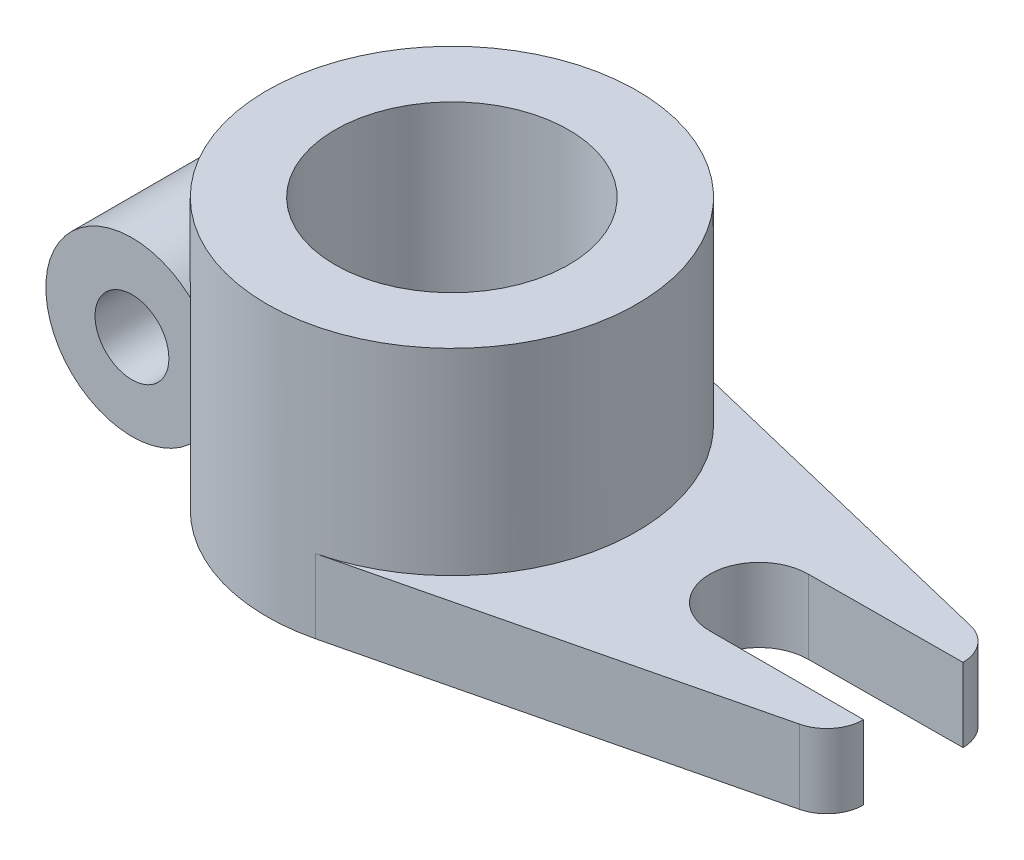
ISO-10303-21;
HEADER;
FILE_DESCRIPTION(('STEP AP214'),'2;1');
FILE_NAME('part.step','',(''),(''),'','','');
FILE_SCHEMA(('AUTOMOTIVE_DESIGN { 1 0 10303 214 1 1 1 1 }'));
ENDSEC;
DATA;
#1=APPLICATION_CONTEXT('core data for automotive mechanical design processes');
#2=APPLICATION_PROTOCOL_DEFINITION('international standard','automotive_design',2000,#1);
#3=PRODUCT_CONTEXT('',#1,'mechanical');
#4=PRODUCT('Part','Part','',(#3));
#5=PRODUCT_RELATED_PRODUCT_CATEGORY('part','',(#4));
#6=PRODUCT_DEFINITION_FORMATION('','',#4);
#7=PRODUCT_DEFINITION_CONTEXT('part definition',#1,'design');
#8=PRODUCT_DEFINITION('design','',#6,#7);
#9=PRODUCT_DEFINITION_SHAPE('','',#8);
#10=(LENGTH_UNIT() NAMED_UNIT(*) SI_UNIT(.MILLI.,.METRE.));
#11=(NAMED_UNIT(*) PLANE_ANGLE_UNIT() SI_UNIT($,.RADIAN.));
#12=(NAMED_UNIT(*) SI_UNIT($,.STERADIAN.) SOLID_ANGLE_UNIT());
#13=UNCERTAINTY_MEASURE_WITH_UNIT(LENGTH_MEASURE(1.E-05),#10,'distance_accuracy_value','');
#14=(GEOMETRIC_REPRESENTATION_CONTEXT(3) GLOBAL_UNCERTAINTY_ASSIGNED_CONTEXT((#13)) GLOBAL_UNIT_ASSIGNED_CONTEXT((#10,
#11,#12)) REPRESENTATION_CONTEXT('',''));
#15=CARTESIAN_POINT('',(0.,0.,0.));
#16=DIRECTION('',(0.,0.,1.));
#17=DIRECTION('',(1.,0.,0.));
#18=AXIS2_PLACEMENT_3D('',#15,#16,#17);
#19=CARTESIAN_POINT('',(0.,44.,-0.0753257186210804));
#20=DIRECTION('',(0.,-1.,0.));
#21=DIRECTION('',(0.,0.,-1.));
#22=AXIS2_PLACEMENT_3D('',#19,#20,#21);
#23=CYLINDRICAL_SURFACE('',#22,30.0732137950188);
#24=DIRECTION('',(0.,-1.,0.));
#25=VECTOR('',#24,1.);
#26=CARTESIAN_POINT('',(7.07125760516046,12.,29.1547188219261));
#27=LINE('',#26,#25);
#28=CARTESIAN_POINT('',(7.07125760516046,12.,29.1547188219261));
#29=VERTEX_POINT('',#28);
#30=CARTESIAN_POINT('',(7.07125760516046,0.,29.1547188219261));
#31=VERTEX_POINT('',#30);
#32=EDGE_CURVE('E316',#29,#31,#27,.T.);
#33=ORIENTED_EDGE('',*,*,#32,.F.);
#34=CARTESIAN_POINT('',(0.,12.,-0.0753257186210804));
#35=DIRECTION('',(0.,1.,0.));
#36=DIRECTION('',(0.,0.,1.));
#37=AXIS2_PLACEMENT_3D('',#34,#35,#36);
#38=CIRCLE('',#37,30.0732137950188);
#39=CARTESIAN_POINT('',(7.0867354895421,12.,-29.3016215506655));
#40=VERTEX_POINT('',#39);
#41=EDGE_CURVE('E257',#29,#40,#38,.T.);
#42=ORIENTED_EDGE('',*,*,#41,.T.);
#43=DIRECTION('',(0.,-1.,0.));
#44=VECTOR('',#43,1.);
#45=CARTESIAN_POINT('',(7.0867354895421,12.,-29.3016215506655));
#46=LINE('',#45,#44);
#47=CARTESIAN_POINT('',(7.0867354895421,0.,-29.3016215506655));
#48=VERTEX_POINT('',#47);
#49=EDGE_CURVE('E317',#40,#48,#46,.T.);
#50=ORIENTED_EDGE('',*,*,#49,.T.);
#51=CARTESIAN_POINT('',(0.,0.,-0.0753257186210804));
#52=DIRECTION('',(0.,1.,0.));
#53=DIRECTION('',(0.,0.,1.));
#54=AXIS2_PLACEMENT_3D('',#51,#52,#53);
#55=CIRCLE('',#54,30.0732137950188);
#56=EDGE_CURVE('E333',#48,#31,#55,.T.);
#57=ORIENTED_EDGE('',*,*,#56,.T.);
#58=EDGE_LOOP('',(#33,#42,#50,#57));
#59=FACE_BOUND('',#58,.T.);
#60=CARTESIAN_POINT('',(0.,44.,-0.0753257186210804));
#61=DIRECTION('',(0.,1.,0.));
#62=DIRECTION('',(0.,0.,1.));
#63=AXIS2_PLACEMENT_3D('',#60,#61,#62);
#64=CIRCLE('',#63,30.0732137950188);
#65=CARTESIAN_POINT('',(0.,44.,29.9978880763978));
#66=VERTEX_POINT('',#65);
#67=EDGE_CURVE('E131',#66,#66,#64,.T.);
#68=ORIENTED_EDGE('',*,*,#67,.F.);
#69=EDGE_LOOP('',(#68));
#70=FACE_BOUND('',#69,.T.);
#71=DIRECTION('',(0.,-1.,0.));
#72=VECTOR('',#71,1.);
#73=CARTESIAN_POINT('',(-25.5108395979611,44.,-16.));
#74=LINE('',#73,#72);
#75=CARTESIAN_POINT('',(-25.5108395979611,23.7415936061934,-16.));
#76=VERTEX_POINT('',#75);
#77=CARTESIAN_POINT('',(-25.5108395979611,5.03244543961911,-16.));
#78=VERTEX_POINT('',#77);
#79=EDGE_CURVE('E58',#76,#78,#74,.T.);
#80=ORIENTED_EDGE('',*,*,#79,.F.);
#81=CARTESIAN_POINT('',(-25.5108395979611,23.7415936061934,-16.));
#82=CARTESIAN_POINT('',(-25.6486968404899,23.8950698751368,-15.7792001161683));
#83=CARTESIAN_POINT('',(-25.7859366966199,24.041079451848,-15.5529224282568));
#84=CARTESIAN_POINT('',(-26.0578825566024,24.318918302519,-15.0905340203085));
#85=CARTESIAN_POINT('',(-26.1925897554957,24.4507544102522,-14.8544281158387));
#86=CARTESIAN_POINT('',(-26.4579334050152,24.7007942937792,-14.373966749596));
#87=CARTESIAN_POINT('',(-26.588580240997,24.8190353751764,-14.1296363629204));
#88=CARTESIAN_POINT('',(-26.8452189388277,25.0431983337729,-13.6330026353381));
#89=CARTESIAN_POINT('',(-26.9712102154159,25.1491186656742,-13.3806982993554));
#90=CARTESIAN_POINT('',(-27.3385021082901,25.4477854208744,-12.6180653288698));
#91=CARTESIAN_POINT('',(-27.5717722900233,25.6238665653162,-12.0972426778646));
#92=CARTESIAN_POINT('',(-28.0117514003724,25.938009471794,-11.0330659968112));
#93=CARTESIAN_POINT('',(-28.2184380661607,26.0760394764189,-10.4896935792604));
#94=CARTESIAN_POINT('',(-28.5225693178337,26.2695790962644,-9.61362159188703));
#95=CARTESIAN_POINT('',(-28.6298801691151,26.3356278488058,-9.28658258591072));
#96=CARTESIAN_POINT('',(-28.8336822640833,26.4577286908705,-8.62728208333612));
#97=CARTESIAN_POINT('',(-28.9301731040958,26.5137804074693,-8.29502039241625));
#98=CARTESIAN_POINT('',(-29.1119211159763,26.6168403016244,-7.62611139239538));
#99=CARTESIAN_POINT('',(-29.1971797117631,26.6638496258389,-7.28946464514815));
#100=CARTESIAN_POINT('',(-29.3561887034216,26.7496815758116,-6.61239761442363));
#101=CARTESIAN_POINT('',(-29.4299379151896,26.7885033593668,-6.27197694653313));
#102=CARTESIAN_POINT('',(-29.5659178761798,26.858796900382,-5.58686618518494));
#103=CARTESIAN_POINT('',(-29.6281081785771,26.890242945644,-5.24216544122918));
#104=CARTESIAN_POINT('',(-29.7404830761895,26.9462230687266,-4.55022464988491));
#105=CARTESIAN_POINT('',(-29.7906665425926,26.9707564967022,-4.20298436690409));
#106=CARTESIAN_POINT('',(-29.8788843182193,27.0133920072309,-3.50659899977771));
#107=CARTESIAN_POINT('',(-29.9169195076087,27.0314945557241,-3.15745405549357));
#108=CARTESIAN_POINT('',(-29.980751767984,27.0616366551952,-2.45778589367782));
#109=CARTESIAN_POINT('',(-30.0065487521332,27.0736761631527,-2.10726266638436));
#110=CARTESIAN_POINT('',(-30.0461930264099,27.092101629736,-1.39912950039715));
#111=CARTESIAN_POINT('',(-30.0598194535345,27.0983831477076,-1.04150447170693));
#112=CARTESIAN_POINT('',(-30.0742979447906,27.105055698933,-0.325977508053935));
#113=CARTESIAN_POINT('',(-30.0751512849287,27.105447320576,0.0319243956772461));
#114=CARTESIAN_POINT('',(-30.0640840125683,27.100349549857,0.74754764230904));
#115=CARTESIAN_POINT('',(-30.0521613128963,27.094859196579,1.10526894615283));
#116=CARTESIAN_POINT('',(-30.015568532973,27.0778789311632,1.81988569116742));
#117=CARTESIAN_POINT('',(-29.9908995673469,27.0663895436232,2.17678120181081));
#118=CARTESIAN_POINT('',(-29.9288798362313,27.037169522918,2.88915514172033));
#119=CARTESIAN_POINT('',(-29.8915311504381,27.019439913241,3.24463379370862));
#120=CARTESIAN_POINT('',(-29.8042505954569,26.9773691265466,3.95361901326047));
#121=CARTESIAN_POINT('',(-29.754319836107,26.9530285326556,4.3071257519527));
#122=CARTESIAN_POINT('',(-29.6420141683314,26.8972385250819,5.01155534722831));
#123=CARTESIAN_POINT('',(-29.5796408064258,26.8657899947967,5.3624785193142));
#124=CARTESIAN_POINT('',(-29.4426403545035,26.7951525322559,6.06111206618007));
#125=CARTESIAN_POINT('',(-29.3680137266677,26.7559638919379,6.40882256161667));
#126=CARTESIAN_POINT('',(-29.1549256819841,26.6411908258592,7.3225342012019));
#127=CARTESIAN_POINT('',(-29.0062483039321,26.5583957453009,7.88531024662896));
#128=CARTESIAN_POINT('',(-28.6779521890979,26.3657757948193,8.99711687883838));
#129=CARTESIAN_POINT('',(-28.4983315524542,26.2559492650351,9.5461466192498));
#130=CARTESIAN_POINT('',(-28.1112175083914,26.0046764367056,10.6244152983607));
#131=CARTESIAN_POINT('',(-27.903835782197,25.8633553979485,11.1537232003987));
#132=CARTESIAN_POINT('',(-27.4640806469496,25.5430310058608,12.1900200697223));
#133=CARTESIAN_POINT('',(-27.2317204647276,25.3640475482855,12.6970206508895));
#134=CARTESIAN_POINT('',(-26.8663525761685,25.0610064931571,13.4404204516207));
#135=CARTESIAN_POINT('',(-26.7407246255966,24.9532650143844,13.6872022206004));
#136=CARTESIAN_POINT('',(-26.4851894901964,24.7255664597394,14.1727660854565));
#137=CARTESIAN_POINT('',(-26.3552830047745,24.6056113737697,14.4115494760711));
#138=CARTESIAN_POINT('',(-26.0916855194308,24.3521767332322,14.8811046898308));
#139=CARTESIAN_POINT('',(-25.9579823426928,24.2186489926527,15.1118437654481));
#140=CARTESIAN_POINT('',(-25.6883903842427,23.9375746789897,15.5635479509335));
#141=CARTESIAN_POINT('',(-25.5525001819241,23.7900186609485,15.7845063268416));
#142=CARTESIAN_POINT('',(-25.4161777417682,23.6351063376499,16.));
#143=B_SPLINE_CURVE_WITH_KNOTS('',3,(#81,#82,#83,#84,#85,#86,#87,#88,#89,#90,#91,#92,#93,#94,
#95,#96,#97,#98,#99,#100,#101,#102,#103,#104,#105,#106,#107,#108,#109,#110,#111,#112,#113,#114,
#115,#116,#117,#118,#119,#120,#121,#122,#123,#124,#125,#126,#127,#128,#129,#130,#131,#132,#133,
#134,#135,#136,#137,#138,#139,#140,#141,#142),.UNSPECIFIED.,.F.,.F.,(4,2,2,2,2,2,2,2,2,2,2,2,2,
2,2,2,2,2,2,2,2,2,2,2,2,2,2,2,2,2,4),(0.,0.906290741578307,1.81214253435976,2.71544609095774,
3.61886282018124,5.40784453156932,7.19831483438022,8.24942647076252,9.30057730909456,
10.351594763861,11.402720277785,12.4574573450982,13.5122935336345,14.5670532799197,
15.6218205101773,16.6953613621131,17.7687949686845,18.8424039647905,19.9159190926858,
20.98925823028,22.0625027240091,23.1356139046894,24.2086846179927,25.9709203459212,
27.7332643106043,29.4887203616716,31.2432513836155,32.1343477453389,33.025299156749,
33.9195321200563,34.8143714747566),.UNSPECIFIED.);
#144=CARTESIAN_POINT('',(-25.4161777417682,23.6351063376499,16.));
#145=VERTEX_POINT('',#144);
#146=EDGE_CURVE('E137',#76,#145,#143,.T.);
#147=ORIENTED_EDGE('',*,*,#146,.T.);
#148=DIRECTION('',(0.,-1.,0.));
#149=VECTOR('',#148,1.);
#150=CARTESIAN_POINT('',(-25.4161777417682,44.,16.));
#151=LINE('',#150,#149);
#152=CARTESIAN_POINT('',(-25.4161777417682,5.1389327081626,16.));
#153=VERTEX_POINT('',#152);
#154=EDGE_CURVE('E126',#145,#153,#151,.T.);
#155=ORIENTED_EDGE('',*,*,#154,.T.);
#156=CARTESIAN_POINT('',(-25.4161777417682,5.1389327081626,16.));
#157=CARTESIAN_POINT('',(-25.554400424566,4.98186197877941,15.7815042594419));
#158=CARTESIAN_POINT('',(-25.6921768526131,4.83235477355709,15.5573911648759));
#159=CARTESIAN_POINT('',(-25.9654871899697,4.54773456758512,15.0990750479396));
#160=CARTESIAN_POINT('',(-26.1010221899405,4.41261438107739,14.8648771454118));
#161=CARTESIAN_POINT('',(-26.3682500941847,4.15625431152586,14.3880123255589));
#162=CARTESIAN_POINT('',(-26.4999530650097,4.03497503610374,14.1453721451277));
#163=CARTESIAN_POINT('',(-26.7589075749908,3.80496039401729,13.651901478171));
#164=CARTESIAN_POINT('',(-26.8861585361926,3.69622665181923,13.4010699363651));
#165=CARTESIAN_POINT('',(-27.2573317027092,3.38960702117639,12.6427761082562));
#166=CARTESIAN_POINT('',(-27.4934765045141,3.20868969530649,12.124543300907));
#167=CARTESIAN_POINT('',(-27.9396520997629,2.88564420871484,11.0649210664658));
#168=CARTESIAN_POINT('',(-28.1496603792953,2.74354936534135,10.5235122077101));
#169=CARTESIAN_POINT('',(-28.4584854396064,2.54461041882338,9.65240981365329));
#170=CARTESIAN_POINT('',(-28.5671484469232,2.47692678659113,9.32858540283433));
#171=CARTESIAN_POINT('',(-28.7738820047976,2.35162988962594,8.67562417769502));
#172=CARTESIAN_POINT('',(-28.871952174605,2.29401698683059,8.34648717290655));
#173=CARTESIAN_POINT('',(-29.0570725224114,2.18790459275877,7.68374052206638));
#174=CARTESIAN_POINT('',(-29.1441242311798,2.1394038350986,7.35013150443862));
#175=CARTESIAN_POINT('',(-29.3069249135501,2.05064916033521,6.67904800670706));
#176=CARTESIAN_POINT('',(-29.3826727213689,2.01039609366546,6.34157313177256));
#177=CARTESIAN_POINT('',(-29.5228585213875,1.93728135805668,5.66224548768087));
#178=CARTESIAN_POINT('',(-29.5872559313252,1.9044460974721,5.32038151805762));
#179=CARTESIAN_POINT('',(-29.7042337810414,1.84572277806772,4.63401526494324));
#180=CARTESIAN_POINT('',(-29.7568131113179,1.81983537148029,4.28951273687656));
#181=CARTESIAN_POINT('',(-29.8500042027725,1.77450968051956,3.59849750115876));
#182=CARTESIAN_POINT('',(-29.8906167902891,1.75507095083466,3.25198493399239));
#183=CARTESIAN_POINT('',(-29.9597789099311,1.72225390371002,2.55747154479749));
#184=CARTESIAN_POINT('',(-29.9883283496378,1.70887563270085,2.20947071138763));
#185=CARTESIAN_POINT('',(-30.0337246675484,1.68770985432633,1.5058767692956));
#186=CARTESIAN_POINT('',(-30.0503383795012,1.68003364486584,1.15026526137469));
#187=CARTESIAN_POINT('',(-30.0709283521431,1.67053192719295,0.438634515679646));
#188=CARTESIAN_POINT('',(-30.074905858699,1.66870584218733,0.0826153215639992));
#189=CARTESIAN_POINT('',(-30.0702173668191,1.67086411681511,-0.629377897021013));
#190=CARTESIAN_POINT('',(-30.0615493991652,1.67484938142165,-0.985351905820157));
#191=CARTESIAN_POINT('',(-30.0315879213282,1.68871610512008,-1.69662306366801));
#192=CARTESIAN_POINT('',(-30.0102954975466,1.6985970568573,-2.05192026832023));
#193=CARTESIAN_POINT('',(-29.9551401265152,1.72446165762479,-2.76127149183814));
#194=CARTESIAN_POINT('',(-29.9212787623255,1.74044453812344,-3.11532566159775));
#195=CARTESIAN_POINT('',(-29.8410733998017,1.77884459962999,-3.82163669497937));
#196=CARTESIAN_POINT('',(-29.7947304754421,1.80126122705763,-4.1738937105814));
#197=CARTESIAN_POINT('',(-29.6896867181853,1.85298484125099,-4.87601966152845));
#198=CARTESIAN_POINT('',(-29.6309872438319,1.88229107057911,-5.2258888550409));
#199=CARTESIAN_POINT('',(-29.5014045932143,1.94838082416197,-5.92262544144991));
#200=CARTESIAN_POINT('',(-29.4305218225473,1.98516409950392,-6.26949293387321));
#201=CARTESIAN_POINT('',(-29.2249014516418,2.09449377931722,-7.19246075699274));
#202=CARTESIAN_POINT('',(-29.0793454563459,2.17442630394081,-7.76534448772458));
#203=CARTESIAN_POINT('',(-28.7561032222849,2.36137421122821,-8.8975335707999));
#204=CARTESIAN_POINT('',(-28.5784146487901,2.46839156208164,-9.45683793312471));
#205=CARTESIAN_POINT('',(-28.1938961829865,2.71421789866929,-10.5557741599948));
#206=CARTESIAN_POINT('',(-27.9871813910684,2.85290260901372,-11.0954736105704));
#207=CARTESIAN_POINT('',(-27.5475805715135,3.16819320682722,-12.1524280032906));
#208=CARTESIAN_POINT('',(-27.3147087674712,3.34477853192407,-12.6696949336437));
#209=CARTESIAN_POINT('',(-26.8279298156059,3.74233303641053,-13.6757544891623));
#210=CARTESIAN_POINT('',(-26.5740579379998,3.96322865037145,-14.1645926001577));
#211=CARTESIAN_POINT('',(-26.1822606755596,4.33333467754066,-14.8726496147746));
#212=CARTESIAN_POINT('',(-26.0495743829789,4.46344051995646,-15.1048745992723));
#213=CARTESIAN_POINT('',(-25.7817422597384,4.7374211154805,-15.559828800354));
#214=CARTESIAN_POINT('',(-25.6465948640804,4.88130489642735,-15.7825516507139));
#215=CARTESIAN_POINT('',(-25.5108395979611,5.03244543961911,-16.));
#216=B_SPLINE_CURVE_WITH_KNOTS('',3,(#156,#157,#158,#159,#160,#161,#162,#163,#164,#165,#166,
#167,#168,#169,#170,#171,#172,#173,#174,#175,#176,#177,#178,#179,#180,#181,#182,#183,#184,#185,
#186,#187,#188,#189,#190,#191,#192,#193,#194,#195,#196,#197,#198,#199,#200,#201,#202,#203,#204,
#205,#206,#207,#208,#209,#210,#211,#212,#213,#214,#215),.UNSPECIFIED.,.F.,.F.,(4,2,2,2,2,2,2,2,
2,2,2,2,2,2,2,2,2,2,2,2,2,2,2,2,2,2,2,2,2,4),(0.,0.907299527272065,1.81414374662887,
2.71833901237477,3.62265122732876,5.41253085088335,7.20394175342913,8.24826432858637,
9.29262442852438,10.3368392783048,11.381161744736,12.4291455134475,13.4772276276427,
14.5252373517449,15.5732551047553,16.6412270905068,17.709093776285,18.7771267734957,
19.8450678741413,20.9128745130587,21.9805893019939,23.0481867620239,24.1157486872776,
25.9035005156103,27.6913822929168,29.4723647560681,31.2523834071437,33.0294709132497,
33.9213196318637,34.813756775937),.UNSPECIFIED.);
#217=EDGE_CURVE('E135',#153,#78,#216,.T.);
#218=ORIENTED_EDGE('',*,*,#217,.T.);
#219=EDGE_LOOP('',(#80,#147,#155,#218));
#220=FACE_BOUND('',#219,.T.);
#221=ADVANCED_FACE('F50',(#59,#70,#220),#23,.T.);
#222=CARTESIAN_POINT('',(0.,44.,-0.0753257186210804));
#223=DIRECTION('',(0.,-1.,0.));
#224=DIRECTION('',(0.,0.,-1.));
#225=AXIS2_PLACEMENT_3D('',#222,#223,#224);
#226=CYLINDRICAL_SURFACE('',#225,19.);
#227=CARTESIAN_POINT('',(0.,44.,-0.0753257186210804));
#228=DIRECTION('',(0.,1.,0.));
#229=DIRECTION('',(0.,0.,1.));
#230=AXIS2_PLACEMENT_3D('',#227,#228,#229);
#231=CIRCLE('',#230,19.);
#232=CARTESIAN_POINT('',(0.,44.,18.9246742813789));
#233=VERTEX_POINT('',#232);
#234=EDGE_CURVE('E332',#233,#233,#231,.T.);
#235=ORIENTED_EDGE('',*,*,#234,.T.);
#236=EDGE_LOOP('',(#235));
#237=FACE_BOUND('',#236,.T.);
#238=CARTESIAN_POINT('',(0.,0.,-0.0753257186210804));
#239=DIRECTION('',(0.,1.,0.));
#240=DIRECTION('',(0.,0.,1.));
#241=AXIS2_PLACEMENT_3D('',#238,#239,#240);
#242=CIRCLE('',#241,19.);
#243=CARTESIAN_POINT('',(0.,0.,18.9246742813789));
#244=VERTEX_POINT('',#243);
#245=EDGE_CURVE('E329',#244,#244,#242,.T.);
#246=ORIENTED_EDGE('',*,*,#245,.F.);
#247=EDGE_LOOP('',(#246));
#248=FACE_BOUND('',#247,.T.);
#249=ADVANCED_FACE('F47',(#237,#248),#226,.F.);
#250=CARTESIAN_POINT('',(0.,44.,0.));
#251=DIRECTION('',(0.,1.,0.));
#252=DIRECTION('',(0.,0.,1.));
#253=AXIS2_PLACEMENT_3D('',#250,#251,#252);
#254=PLANE('',#253);
#255=ORIENTED_EDGE('',*,*,#234,.F.);
#256=EDGE_LOOP('',(#255));
#257=FACE_BOUND('',#256,.T.);
#258=ORIENTED_EDGE('',*,*,#67,.T.);
#259=EDGE_LOOP('',(#258));
#260=FACE_BOUND('',#259,.T.);
#261=ADVANCED_FACE('F205',(#257,#260),#254,.T.);
#262=CARTESIAN_POINT('',(0.,0.,0.));
#263=DIRECTION('',(0.,1.,0.));
#264=DIRECTION('',(0.,0.,1.));
#265=AXIS2_PLACEMENT_3D('',#262,#263,#264);
#266=PLANE('',#265);
#267=ORIENTED_EDGE('',*,*,#245,.T.);
#268=EDGE_LOOP('',(#267));
#269=FACE_BOUND('',#268,.T.);
#270=ORIENTED_EDGE('',*,*,#56,.F.);
#271=DIRECTION('',(0.971838129148847,0.,0.23564942336545));
#272=VECTOR('',#271,1.);
#273=CARTESIAN_POINT('',(7.10398606547691,0.,-29.2974386644936));
#274=LINE('',#273,#272);
#275=CARTESIAN_POINT('',(70.4133948669904,0.,-13.9462960922728));
#276=VERTEX_POINT('',#275);
#277=EDGE_CURVE('E288',#48,#276,#274,.T.);
#278=ORIENTED_EDGE('',*,*,#277,.T.);
#279=CARTESIAN_POINT('',(68.9993100710451,0.,-8.11449093475282));
#280=DIRECTION('',(0.,1.,0.));
#281=DIRECTION('',(0.,0.,1.));
#282=AXIS2_PLACEMENT_3D('',#279,#280,#281);
#283=CIRCLE('',#282,6.0007988805992);
#284=CARTESIAN_POINT('',(75.,0.,-8.15065143724216));
#285=VERTEX_POINT('',#284);
#286=EDGE_CURVE('E284',#285,#276,#283,.T.);
#287=ORIENTED_EDGE('',*,*,#286,.F.);
#288=DIRECTION('',(0.999981843810049,0.,-0.00602594807938787));
#289=VECTOR('',#288,1.);
#290=CARTESIAN_POINT('',(-0.0463911068562734,0.,-7.69841757004281));
#291=LINE('',#290,#289);
#292=CARTESIAN_POINT('',(50.,0.,-8.00000000000135));
#293=VERTEX_POINT('',#292);
#294=EDGE_CURVE('E248',#293,#285,#291,.T.);
#295=ORIENTED_EDGE('',*,*,#294,.F.);
#296=CARTESIAN_POINT('',(50.,0.,0.));
#297=DIRECTION('',(0.,1.,0.));
#298=DIRECTION('',(0.,0.,1.));
#299=AXIS2_PLACEMENT_3D('',#296,#297,#298);
#300=CIRCLE('',#299,8.00000000000114);
#301=CARTESIAN_POINT('',(49.9999999999999,0.,8.00000000000092));
#302=VERTEX_POINT('',#301);
#303=EDGE_CURVE('E254',#293,#302,#300,.T.);
#304=ORIENTED_EDGE('',*,*,#303,.T.);
#305=DIRECTION('',(1.,0.,0.));
#306=VECTOR('',#305,1.);
#307=CARTESIAN_POINT('',(2.95874436062706E-13,0.,8.00000000000277));
#308=LINE('',#307,#306);
#309=CARTESIAN_POINT('',(75.,0.,8.));
#310=VERTEX_POINT('',#309);
#311=EDGE_CURVE('E299',#302,#310,#308,.T.);
#312=ORIENTED_EDGE('',*,*,#311,.T.);
#313=CARTESIAN_POINT('',(69.,0.,8.00000000000021));
#314=DIRECTION('',(0.,1.,0.));
#315=DIRECTION('',(0.,0.,1.));
#316=AXIS2_PLACEMENT_3D('',#313,#314,#315);
#317=CIRCLE('',#316,6.00000000000001);
#318=CARTESIAN_POINT('',(70.4108084995555,0.,13.8317766913338));
#319=VERTEX_POINT('',#318);
#320=EDGE_CURVE('E291',#319,#310,#317,.T.);
#321=ORIENTED_EDGE('',*,*,#320,.F.);
#322=DIRECTION('',(0.971962781888934,0.,-0.235134749925919));
#323=VECTOR('',#322,1.);
#324=CARTESIAN_POINT('',(7.0540424977776,0.,29.1588834566681));
#325=LINE('',#324,#323);
#326=EDGE_CURVE('E287',#31,#319,#325,.T.);
#327=ORIENTED_EDGE('',*,*,#326,.F.);
#328=EDGE_LOOP('',(#270,#278,#287,#295,#304,#312,#321,#327));
#329=FACE_BOUND('',#328,.T.);
#330=ADVANCED_FACE('F199',(#269,#329),#266,.F.);
#331=CARTESIAN_POINT('',(-0.0463911068562734,12.,-7.69841757004281));
#332=DIRECTION('',(-0.00602594807938787,0.,-0.999981843810049));
#333=DIRECTION('',(-0.999981843810049,0.,0.00602594807938787));
#334=AXIS2_PLACEMENT_3D('',#331,#332,#333);
#335=PLANE('',#334);
#336=ORIENTED_EDGE('',*,*,#294,.T.);
#337=DIRECTION('',(0.,-1.,0.));
#338=VECTOR('',#337,1.);
#339=CARTESIAN_POINT('',(75.,12.,-8.15065143724216));
#340=LINE('',#339,#338);
#341=CARTESIAN_POINT('',(75.,12.,-8.15065143724216));
#342=VERTEX_POINT('',#341);
#343=EDGE_CURVE('E326',#342,#285,#340,.T.);
#344=ORIENTED_EDGE('',*,*,#343,.F.);
#345=DIRECTION('',(0.999981843810049,0.,-0.00602594807938787));
#346=VECTOR('',#345,1.);
#347=CARTESIAN_POINT('',(-0.0463911068562734,12.,-7.69841757004281));
#348=LINE('',#347,#346);
#349=CARTESIAN_POINT('',(50.,12.,-8.00000000000135));
#350=VERTEX_POINT('',#349);
#351=EDGE_CURVE('E247',#350,#342,#348,.T.);
#352=ORIENTED_EDGE('',*,*,#351,.F.);
#353=DIRECTION('',(0.,-1.,0.));
#354=VECTOR('',#353,1.);
#355=CARTESIAN_POINT('',(50.,12.,-8.00000000000135));
#356=LINE('',#355,#354);
#357=EDGE_CURVE('E279',#350,#293,#356,.T.);
#358=ORIENTED_EDGE('',*,*,#357,.T.);
#359=EDGE_LOOP('',(#336,#344,#352,#358));
#360=FACE_BOUND('',#359,.T.);
#361=ADVANCED_FACE('F198',(#360),#335,.F.);
#362=CARTESIAN_POINT('',(68.9993100710451,12.,-8.11449093475282));
#363=DIRECTION('',(0.,-1.,0.));
#364=DIRECTION('',(0.,0.,-1.));
#365=AXIS2_PLACEMENT_3D('',#362,#363,#364);
#366=CYLINDRICAL_SURFACE('',#365,6.0007988805992);
#367=ORIENTED_EDGE('',*,*,#286,.T.);
#368=DIRECTION('',(0.,-1.,0.));
#369=VECTOR('',#368,1.);
#370=CARTESIAN_POINT('',(70.4133948669904,12.,-13.9462960922728));
#371=LINE('',#370,#369);
#372=CARTESIAN_POINT('',(70.4133948669904,12.,-13.9462960922728));
#373=VERTEX_POINT('',#372);
#374=EDGE_CURVE('E323',#373,#276,#371,.T.);
#375=ORIENTED_EDGE('',*,*,#374,.F.);
#376=CARTESIAN_POINT('',(68.9993100710451,12.,-8.11449093475282));
#377=DIRECTION('',(0.,1.,0.));
#378=DIRECTION('',(0.,0.,1.));
#379=AXIS2_PLACEMENT_3D('',#376,#377,#378);
#380=CIRCLE('',#379,6.0007988805992);
#381=EDGE_CURVE('E255',#342,#373,#380,.T.);
#382=ORIENTED_EDGE('',*,*,#381,.F.);
#383=ORIENTED_EDGE('',*,*,#343,.T.);
#384=EDGE_LOOP('',(#367,#375,#382,#383));
#385=FACE_BOUND('',#384,.T.);
#386=ADVANCED_FACE('F195',(#385),#366,.T.);
#387=CARTESIAN_POINT('',(7.10398606547691,12.,-29.2974386644936));
#388=DIRECTION('',(0.23564942336545,0.,-0.971838129148847));
#389=DIRECTION('',(-0.971838129148847,0.,-0.23564942336545));
#390=AXIS2_PLACEMENT_3D('',#387,#388,#389);
#391=PLANE('',#390);
#392=ORIENTED_EDGE('',*,*,#277,.F.);
#393=ORIENTED_EDGE('',*,*,#49,.F.);
#394=DIRECTION('',(0.971838129148847,0.,0.23564942336545));
#395=VECTOR('',#394,1.);
#396=CARTESIAN_POINT('',(7.10398606547691,12.,-29.2974386644936));
#397=LINE('',#396,#395);
#398=EDGE_CURVE('E74',#40,#373,#397,.T.);
#399=ORIENTED_EDGE('',*,*,#398,.T.);
#400=ORIENTED_EDGE('',*,*,#374,.T.);
#401=EDGE_LOOP('',(#392,#393,#399,#400));
#402=FACE_BOUND('',#401,.T.);
#403=ADVANCED_FACE('F187',(#402),#391,.T.);
#404=CARTESIAN_POINT('',(7.0540424977776,12.,29.1588834566681));
#405=DIRECTION('',(-0.235134749925919,0.,-0.971962781888934));
#406=DIRECTION('',(-0.971962781888934,0.,0.235134749925919));
#407=AXIS2_PLACEMENT_3D('',#404,#405,#406);
#408=PLANE('',#407);
#409=ORIENTED_EDGE('',*,*,#326,.T.);
#410=DIRECTION('',(0.,-1.,0.));
#411=VECTOR('',#410,1.);
#412=CARTESIAN_POINT('',(70.4108084995555,12.,13.8317766913338));
#413=LINE('',#412,#411);
#414=CARTESIAN_POINT('',(70.4108084995555,12.,13.8317766913338));
#415=VERTEX_POINT('',#414);
#416=EDGE_CURVE('E315',#415,#319,#413,.T.);
#417=ORIENTED_EDGE('',*,*,#416,.F.);
#418=DIRECTION('',(0.971962781888934,0.,-0.235134749925919));
#419=VECTOR('',#418,1.);
#420=CARTESIAN_POINT('',(7.0540424977776,12.,29.1588834566681));
#421=LINE('',#420,#419);
#422=EDGE_CURVE('E262',#29,#415,#421,.T.);
#423=ORIENTED_EDGE('',*,*,#422,.F.);
#424=ORIENTED_EDGE('',*,*,#32,.T.);
#425=EDGE_LOOP('',(#409,#417,#423,#424));
#426=FACE_BOUND('',#425,.T.);
#427=ADVANCED_FACE('F184',(#426),#408,.F.);
#428=CARTESIAN_POINT('',(69.,12.,8.00000000000021));
#429=DIRECTION('',(0.,-1.,0.));
#430=DIRECTION('',(0.,0.,-1.));
#431=AXIS2_PLACEMENT_3D('',#428,#429,#430);
#432=CYLINDRICAL_SURFACE('',#431,6.00000000000001);
#433=ORIENTED_EDGE('',*,*,#320,.T.);
#434=DIRECTION('',(0.,-1.,0.));
#435=VECTOR('',#434,1.);
#436=CARTESIAN_POINT('',(75.,12.,8.));
#437=LINE('',#436,#435);
#438=CARTESIAN_POINT('',(75.,12.,8.));
#439=VERTEX_POINT('',#438);
#440=EDGE_CURVE('E310',#439,#310,#437,.T.);
#441=ORIENTED_EDGE('',*,*,#440,.F.);
#442=CARTESIAN_POINT('',(69.,12.,8.00000000000021));
#443=DIRECTION('',(0.,1.,0.));
#444=DIRECTION('',(0.,0.,1.));
#445=AXIS2_PLACEMENT_3D('',#442,#443,#444);
#446=CIRCLE('',#445,6.00000000000001);
#447=EDGE_CURVE('E270',#415,#439,#446,.T.);
#448=ORIENTED_EDGE('',*,*,#447,.F.);
#449=ORIENTED_EDGE('',*,*,#416,.T.);
#450=EDGE_LOOP('',(#433,#441,#448,#449));
#451=FACE_BOUND('',#450,.T.);
#452=ADVANCED_FACE('F177',(#451),#432,.T.);
#453=CARTESIAN_POINT('',(2.95874436062706E-13,12.,8.00000000000277));
#454=DIRECTION('',(0.,0.,-1.));
#455=DIRECTION('',(-1.,0.,0.));
#456=AXIS2_PLACEMENT_3D('',#453,#454,#455);
#457=PLANE('',#456);
#458=ORIENTED_EDGE('',*,*,#311,.F.);
#459=DIRECTION('',(0.,-1.,0.));
#460=VECTOR('',#459,1.);
#461=CARTESIAN_POINT('',(49.9999999999999,12.,8.00000000000092));
#462=LINE('',#461,#460);
#463=CARTESIAN_POINT('',(49.9999999999999,12.,8.00000000000092));
#464=VERTEX_POINT('',#463);
#465=EDGE_CURVE('E308',#464,#302,#462,.T.);
#466=ORIENTED_EDGE('',*,*,#465,.F.);
#467=DIRECTION('',(1.,0.,0.));
#468=VECTOR('',#467,1.);
#469=CARTESIAN_POINT('',(2.95874436062706E-13,12.,8.00000000000277));
#470=LINE('',#469,#468);
#471=EDGE_CURVE('E269',#464,#439,#470,.T.);
#472=ORIENTED_EDGE('',*,*,#471,.T.);
#473=ORIENTED_EDGE('',*,*,#440,.T.);
#474=EDGE_LOOP('',(#458,#466,#472,#473));
#475=FACE_BOUND('',#474,.T.);
#476=ADVANCED_FACE('F178',(#475),#457,.T.);
#477=CARTESIAN_POINT('',(50.,12.,0.));
#478=DIRECTION('',(0.,-1.,0.));
#479=DIRECTION('',(0.,0.,-1.));
#480=AXIS2_PLACEMENT_3D('',#477,#478,#479);
#481=CYLINDRICAL_SURFACE('',#480,8.00000000000114);
#482=ORIENTED_EDGE('',*,*,#303,.F.);
#483=ORIENTED_EDGE('',*,*,#357,.F.);
#484=CARTESIAN_POINT('',(50.,12.,0.));
#485=DIRECTION('',(0.,1.,0.));
#486=DIRECTION('',(0.,0.,1.));
#487=AXIS2_PLACEMENT_3D('',#484,#485,#486);
#488=CIRCLE('',#487,8.00000000000114);
#489=EDGE_CURVE('E273',#350,#464,#488,.T.);
#490=ORIENTED_EDGE('',*,*,#489,.T.);
#491=ORIENTED_EDGE('',*,*,#465,.T.);
#492=EDGE_LOOP('',(#482,#483,#490,#491));
#493=FACE_BOUND('',#492,.T.);
#494=ADVANCED_FACE('F172',(#493),#481,.F.);
#495=CARTESIAN_POINT('',(0.,12.,0.));
#496=DIRECTION('',(0.,1.,0.));
#497=DIRECTION('',(0.,0.,1.));
#498=AXIS2_PLACEMENT_3D('',#495,#496,#497);
#499=PLANE('',#498);
#500=ORIENTED_EDGE('',*,*,#351,.T.);
#501=ORIENTED_EDGE('',*,*,#381,.T.);
#502=ORIENTED_EDGE('',*,*,#398,.F.);
#503=ORIENTED_EDGE('',*,*,#41,.F.);
#504=ORIENTED_EDGE('',*,*,#422,.T.);
#505=ORIENTED_EDGE('',*,*,#447,.T.);
#506=ORIENTED_EDGE('',*,*,#471,.F.);
#507=ORIENTED_EDGE('',*,*,#489,.F.);
#508=EDGE_LOOP('',(#500,#501,#502,#503,#504,#505,#506,#507));
#509=FACE_BOUND('',#508,.T.);
#510=ADVANCED_FACE('F166',(#509),#499,.T.);
#511=CARTESIAN_POINT('',(-35.9267862049812,14.3870195229063,-16.));
#512=DIRECTION('',(0.,0.,1.));
#513=DIRECTION('',(1.,0.,0.));
#514=AXIS2_PLACEMENT_3D('',#511,#512,#513);
#515=CYLINDRICAL_SURFACE('',#514,14.);
#516=ORIENTED_EDGE('',*,*,#146,.F.);
#517=CARTESIAN_POINT('',(-35.9267862049812,14.3870195229063,-16.));
#518=DIRECTION('',(0.,0.,1.));
#519=DIRECTION('',(1.,0.,0.));
#520=AXIS2_PLACEMENT_3D('',#517,#518,#519);
#521=CIRCLE('',#520,14.);
#522=EDGE_CURVE('E242',#76,#78,#521,.T.);
#523=ORIENTED_EDGE('',*,*,#522,.T.);
#524=ORIENTED_EDGE('',*,*,#217,.F.);
#525=CARTESIAN_POINT('',(-35.9267862049812,14.3870195229063,16.));
#526=DIRECTION('',(0.,0.,1.));
#527=DIRECTION('',(1.,0.,0.));
#528=AXIS2_PLACEMENT_3D('',#525,#526,#527);
#529=CIRCLE('',#528,14.);
#530=EDGE_CURVE('E68',#145,#153,#529,.T.);
#531=ORIENTED_EDGE('',*,*,#530,.F.);
#532=EDGE_LOOP('',(#516,#523,#524,#531));
#533=FACE_BOUND('',#532,.T.);
#534=ADVANCED_FACE('F136',(#533),#515,.T.);
#535=CARTESIAN_POINT('',(-35.9267862049812,14.3870195229063,-16.));
#536=DIRECTION('',(0.,0.,1.));
#537=DIRECTION('',(1.,0.,0.));
#538=AXIS2_PLACEMENT_3D('',#535,#536,#537);
#539=PLANE('',#538);
#540=CARTESIAN_POINT('',(-35.9267862049812,14.3870195229063,-16.));
#541=DIRECTION('',(0.,0.,1.));
#542=DIRECTION('',(1.,0.,0.));
#543=AXIS2_PLACEMENT_3D('',#540,#541,#542);
#544=CIRCLE('',#543,6.00000000000001);
#545=CARTESIAN_POINT('',(-29.9267862049811,14.3870195229063,-16.));
#546=VERTEX_POINT('',#545);
#547=EDGE_CURVE('E141',#546,#546,#544,.T.);
#548=ORIENTED_EDGE('',*,*,#547,.T.);
#549=EDGE_LOOP('',(#548));
#550=FACE_BOUND('',#549,.T.);
#551=ORIENTED_EDGE('',*,*,#522,.F.);
#552=ORIENTED_EDGE('',*,*,#79,.T.);
#553=EDGE_LOOP('',(#551,#552));
#554=FACE_BOUND('',#553,.T.);
#555=ADVANCED_FACE('F169',(#550,#554),#539,.F.);
#556=CARTESIAN_POINT('',(-35.9267862049812,14.3870195229063,-16.));
#557=DIRECTION('',(0.,0.,1.));
#558=DIRECTION('',(1.,0.,0.));
#559=AXIS2_PLACEMENT_3D('',#556,#557,#558);
#560=CYLINDRICAL_SURFACE('',#559,6.00000000000001);
#561=CARTESIAN_POINT('',(-35.9267862049812,14.3870195229063,16.));
#562=DIRECTION('',(0.,0.,1.));
#563=DIRECTION('',(1.,0.,0.));
#564=AXIS2_PLACEMENT_3D('',#561,#562,#563);
#565=CIRCLE('',#564,6.00000000000001);
#566=CARTESIAN_POINT('',(-29.9267862049811,14.3870195229063,16.));
#567=VERTEX_POINT('',#566);
#568=EDGE_CURVE('E145',#567,#567,#565,.T.);
#569=ORIENTED_EDGE('',*,*,#568,.T.);
#570=EDGE_LOOP('',(#569));
#571=FACE_BOUND('',#570,.T.);
#572=ORIENTED_EDGE('',*,*,#547,.F.);
#573=EDGE_LOOP('',(#572));
#574=FACE_BOUND('',#573,.T.);
#575=CARTESIAN_POINT('',(-29.9267862049811,14.3870195229063,-3.03938634591293));
#576=CARTESIAN_POINT('',(-29.9267859969657,14.4234874509117,-3.03938821496808));
#577=CARTESIAN_POINT('',(-29.927122535694,14.4599500220458,-3.03599629217049));
#578=CARTESIAN_POINT('',(-29.9284230352854,14.5316941242958,-3.02282036641377));
#579=CARTESIAN_POINT('',(-29.9293876407025,14.5669744029302,-3.01302979679815));
#580=CARTESIAN_POINT('',(-29.9321135125256,14.6432855021681,-2.98513719045655));
#581=CARTESIAN_POINT('',(-29.9340060798426,14.6837990309857,-2.96565118096278));
#582=CARTESIAN_POINT('',(-29.9383353095984,14.7611373685347,-2.9204591216063));
#583=CARTESIAN_POINT('',(-29.9407730044196,14.7979549835478,-2.89474126180894));
#584=CARTESIAN_POINT('',(-29.9475361561941,14.8887291163583,-2.82218705432299));
#585=CARTESIAN_POINT('',(-29.9521224662086,14.9398657737145,-2.77188398505589));
#586=CARTESIAN_POINT('',(-29.9616051208063,15.0342172712032,-2.66440824791377));
#587=CARTESIAN_POINT('',(-29.9665022691123,15.0774103478132,-2.60721739735926));
#588=CARTESIAN_POINT('',(-29.9761849476808,15.1563598423793,-2.48984716706402));
#589=CARTESIAN_POINT('',(-29.9809705023034,15.1922621143749,-2.42976438331846));
#590=CARTESIAN_POINT('',(-29.9903769408102,15.2588964406327,-2.30676077020706));
#591=CARTESIAN_POINT('',(-29.9949976638218,15.2896235472771,-2.24383729709791));
#592=CARTESIAN_POINT('',(-30.008458538274,15.3753511149493,-2.05193805343479));
#593=CARTESIAN_POINT('',(-30.0168830016433,15.4237912889755,-1.92000489921303));
#594=CARTESIAN_POINT('',(-30.0323615744835,15.5084514110679,-1.64839375510029));
#595=CARTESIAN_POINT('',(-30.0393715216933,15.5442978053975,-1.50860252874887));
#596=CARTESIAN_POINT('',(-30.0515102024188,15.6044218125933,-1.22636418989448));
#597=CARTESIAN_POINT('',(-30.0566370550762,15.6286878660692,-1.08391457053363));
#598=CARTESIAN_POINT('',(-30.0648853634535,15.6670575426378,-0.797428634671998));
#599=CARTESIAN_POINT('',(-30.0680040594805,15.6811471840987,-0.653390410174398));
#600=CARTESIAN_POINT('',(-30.0721693944904,15.699860391399,-0.36460685162422));
#601=CARTESIAN_POINT('',(-30.0732149468729,15.7044789932094,-0.219861186599386));
#602=CARTESIAN_POINT('',(-30.073212534212,15.7044715070822,0.0831293408044764));
#603=CARTESIAN_POINT('',(-30.071960380493,15.6989437358177,0.241375086206742));
#604=CARTESIAN_POINT('',(-30.0669803265153,15.6765187785611,0.556953184145803));
#605=CARTESIAN_POINT('',(-30.063253630281,15.6596271217786,0.71428594337267));
#606=CARTESIAN_POINT('',(-30.0533979881264,15.6133497765364,1.02740244312632));
#607=CARTESIAN_POINT('',(-30.0472643526461,15.5839396882597,1.18318254727802));
#608=CARTESIAN_POINT('',(-30.0327940544471,15.5105234577106,1.49093744751401));
#609=CARTESIAN_POINT('',(-30.0244610747186,15.4665416858258,1.64291814454262));
#610=CARTESIAN_POINT('',(-30.006165972269,15.3612643950255,1.93692521289643));
#611=CARTESIAN_POINT('',(-29.9962487358572,15.3004191804544,2.07910420237124));
#612=CARTESIAN_POINT('',(-29.9807718788035,15.190888985522,2.28181730033993));
#613=CARTESIAN_POINT('',(-29.9755352632326,15.1515318355109,2.34738352376092));
#614=CARTESIAN_POINT('',(-29.9650894689238,15.0653091736129,2.47330880471121));
#615=CARTESIAN_POINT('',(-29.9598802543889,15.0184648693195,2.53368185035196));
#616=CARTESIAN_POINT('',(-29.9514317881407,14.9314496121615,2.62864436339405));
#617=CARTESIAN_POINT('',(-29.9480821760441,14.8937067293736,2.66542745485889));
#618=CARTESIAN_POINT('',(-29.9418067368378,14.8132188139717,2.73315149708902));
#619=CARTESIAN_POINT('',(-29.938880190609,14.7704824981869,2.76410238915778));
#620=CARTESIAN_POINT('',(-29.9344786529383,14.6925011592394,2.81007836492748));
#621=CARTESIAN_POINT('',(-29.9328263259553,14.6584783779219,2.82713865746651));
#622=CARTESIAN_POINT('',(-29.9300536463043,14.588101537204,2.85559256633032));
#623=CARTESIAN_POINT('',(-29.9289327548229,14.5517498816529,2.86699192274118));
#624=CARTESIAN_POINT('',(-29.9273475033286,14.477202984114,2.88307401770252));
#625=CARTESIAN_POINT('',(-29.9268889495383,14.4389944372653,2.88769736108924));
#626=CARTESIAN_POINT('',(-29.9267146557137,14.3624067591953,2.88945750238635));
#627=CARTESIAN_POINT('',(-29.9269986703166,14.3240276885028,2.88659677321793));
#628=CARTESIAN_POINT('',(-29.928188530887,14.2531061775616,2.8745466705154));
#629=CARTESIAN_POINT('',(-29.9290150195309,14.2204192006019,2.86616451448964));
#630=CARTESIAN_POINT('',(-29.9311239361192,14.1566891479952,2.84462721989744));
#631=CARTESIAN_POINT('',(-29.9324065941806,14.1256469111437,2.83146967229034));
#632=CARTESIAN_POINT('',(-29.9360942169893,14.0498021593595,2.79329407146038));
#633=CARTESIAN_POINT('',(-29.938734927497,14.0063258550489,2.76567521526435));
#634=CARTESIAN_POINT('',(-29.9445198229378,13.9242114631895,2.70404276529013));
#635=CARTESIAN_POINT('',(-29.9476654306033,13.8855876143488,2.67001105234046));
#636=CARTESIAN_POINT('',(-29.9565932828135,13.7863485383266,2.57129403176344));
#637=CARTESIAN_POINT('',(-29.9626328691539,13.7301055336615,2.50228065431793));
#638=CARTESIAN_POINT('',(-29.9747714907109,13.6279748613946,2.35708894408048));
#639=CARTESIAN_POINT('',(-29.9808706381715,13.5821139365886,2.28089280799978));
#640=CARTESIAN_POINT('',(-29.9929185059153,13.4975962441451,2.12228610105669));
#641=CARTESIAN_POINT('',(-29.9988601127736,13.4591385812555,2.0397703301194));
#642=CARTESIAN_POINT('',(-30.0102337218283,13.3891987105912,1.87177087463506));
#643=CARTESIAN_POINT('',(-30.0156652049645,13.3577235642484,1.78628428580868));
#644=CARTESIAN_POINT('',(-30.031023766542,13.2719197004851,1.52649429326346));
#645=CARTESIAN_POINT('',(-30.0399871202406,13.2263878016686,1.34922012744092));
#646=CARTESIAN_POINT('',(-30.054399519616,13.1556719231964,1.00163596901511));
#647=CARTESIAN_POINT('',(-30.0600243076238,13.1294483534178,0.831529913217968));
#648=CARTESIAN_POINT('',(-30.0683953880879,13.0910061843872,0.489517230852506));
#649=CARTESIAN_POINT('',(-30.0711389601847,13.0788008196965,0.317609057133036));
#650=CARTESIAN_POINT('',(-30.0736650978583,13.06755032465,-0.0263366498410095));
#651=CARTESIAN_POINT('',(-30.0734528237403,13.0684822592819,-0.198373433477632));
#652=CARTESIAN_POINT('',(-30.07008630534,13.083511678348,-0.541729375302907));
#653=CARTESIAN_POINT('',(-30.0669343875506,13.097598751554,-0.713048993381326));
#654=CARTESIAN_POINT('',(-30.0579223031133,13.1392709956443,-1.04831338632605));
#655=CARTESIAN_POINT('',(-30.052153795633,13.1664010558253,-1.21231648270449));
#656=CARTESIAN_POINT('',(-30.0380994312887,13.2360727043907,-1.53722295342876));
#657=CARTESIAN_POINT('',(-30.0298113676169,13.2786278094442,-1.69812347841064));
#658=CARTESIAN_POINT('',(-30.0128329219484,13.373600557938,-1.98444385797872));
#659=CARTESIAN_POINT('',(-30.0044958759956,13.4227722971436,-2.11095356875669));
#660=CARTESIAN_POINT('',(-29.9868660092739,13.53799335913,-2.35585976539376));
#661=CARTESIAN_POINT('',(-29.9775781111894,13.6039581451025,-2.47429322810362));
#662=CARTESIAN_POINT('',(-29.9647583824509,13.7123887096519,-2.62745685929213));
#663=CARTESIAN_POINT('',(-29.9611606144295,13.7447534931448,-2.66929423056448));
#664=CARTESIAN_POINT('',(-29.9541209804763,13.8138792637692,-2.74935333448289));
#665=CARTESIAN_POINT('',(-29.9506793315877,13.8506461272759,-2.78757010934839));
#666=CARTESIAN_POINT('',(-29.9441124480546,13.9296293112921,-2.85914080253229));
#667=CARTESIAN_POINT('',(-29.9409917931485,13.9719089787981,-2.8924267094038));
#668=CARTESIAN_POINT('',(-29.9354375622261,14.061829868471,-2.95084798063643));
#669=CARTESIAN_POINT('',(-29.9330017631292,14.1094530242029,-2.97600975678735));
#670=CARTESIAN_POINT('',(-29.9297311930401,14.1955903376851,-3.00953499185284));
#671=CARTESIAN_POINT('',(-29.9286406221929,14.2330257570158,-3.02061201086374));
#672=CARTESIAN_POINT('',(-29.927168784109,14.3093175036335,-3.03553113177521));
#673=CARTESIAN_POINT('',(-29.9267864265725,14.3481715527247,-3.0393843548758));
#674=CARTESIAN_POINT('',(-29.9267862049811,14.3870195229063,-3.03938634591293));
#675=B_SPLINE_CURVE_WITH_KNOTS('',3,(#575,#576,#577,#578,#579,#580,#581,#582,#583,#584,#585,
#586,#587,#588,#589,#590,#591,#592,#593,#594,#595,#596,#597,#598,#599,#600,#601,#602,#603,#604,
#605,#606,#607,#608,#609,#610,#611,#612,#613,#614,#615,#616,#617,#618,#619,#620,#621,#622,#623,
#624,#625,#626,#627,#628,#629,#630,#631,#632,#633,#634,#635,#636,#637,#638,#639,#640,#641,#642,
#643,#644,#645,#646,#647,#648,#649,#650,#651,#652,#653,#654,#655,#656,#657,#658,#659,#660,#661,
#662,#663,#664,#665,#666,#667,#668,#669,#670,#671,#672,#673,#674),.UNSPECIFIED.,.T.,.F.,(4,2,2,
2,2,2,2,2,2,2,2,2,2,2,2,2,2,2,2,2,2,2,2,2,2,2,2,2,2,2,2,2,2,2,2,2,2,2,2,2,2,2,2,2,2,2,2,2,2,4),
(0.,0.109244915520908,0.218602120830166,0.352833473813879,0.487321224941959,0.701744165176487,
0.916746095207086,1.12689498424729,1.33724365550814,1.75854229199888,2.19145110972434,
2.6247911538709,3.05872544822042,3.49288712124455,3.96751094191139,4.44190399657542,
4.917225960998,5.39175695342967,5.85466882278842,6.08426435154461,6.3132207080255,
6.47125106135191,6.62900955711063,6.74289192341757,6.85665857808955,6.9714166111725,
7.08613673017533,7.18698278017475,7.28787977483075,7.44171735560544,7.59599629651268,
7.86219235241734,8.12906648202128,8.40233960545962,8.6758878432789,9.22417579196145,
9.74020406437461,10.2567191186882,10.7723325562003,11.2875382728941,11.7859446544668,
12.2847888399612,12.6920324369046,13.0972651516406,13.2560907626839,13.4151308061849,
13.5761930894435,13.7367263551184,13.853280614565,13.9696552882237),.UNSPECIFIED.);
#676=CARTESIAN_POINT('',(-29.9267862049811,14.3870195229063,-3.03938634591293));
#677=VERTEX_POINT('',#676);
#678=EDGE_CURVE('E11',#677,#677,#675,.T.);
#679=ORIENTED_EDGE('',*,*,#678,.T.);
#680=EDGE_LOOP('',(#679));
#681=FACE_BOUND('',#680,.T.);
#682=ADVANCED_FACE('F228',(#571,#574,#681),#560,.F.);
#683=CARTESIAN_POINT('',(-35.9267862049812,14.3870195229063,16.));
#684=DIRECTION('',(0.,0.,1.));
#685=DIRECTION('',(1.,0.,0.));
#686=AXIS2_PLACEMENT_3D('',#683,#684,#685);
#687=PLANE('',#686);
#688=ORIENTED_EDGE('',*,*,#568,.F.);
#689=EDGE_LOOP('',(#688));
#690=FACE_BOUND('',#689,.T.);
#691=ORIENTED_EDGE('',*,*,#154,.F.);
#692=ORIENTED_EDGE('',*,*,#530,.T.);
#693=EDGE_LOOP('',(#691,#692));
#694=FACE_BOUND('',#693,.T.);
#695=ADVANCED_FACE('F129',(#690,#694),#687,.T.);
#696=ORIENTED_EDGE('',*,*,#678,.F.);
#697=EDGE_LOOP('',(#696));
#698=FACE_BOUND('',#697,.T.);
#699=ADVANCED_FACE('F161',(#698),#23,.T.);
#700=CLOSED_SHELL('',(#221,#249,#261,#330,#361,#386,#403,#427,#452,#476,#494,#510,#534,#555,
#682,#695,#699));
#701=MANIFOLD_SOLID_BREP('B2',#700);
#702=ADVANCED_BREP_SHAPE_REPRESENTATION('',(#18,#701),#14);
#703=SHAPE_DEFINITION_REPRESENTATION(#9,#702);
ENDSEC;
END-ISO-10303-21;
